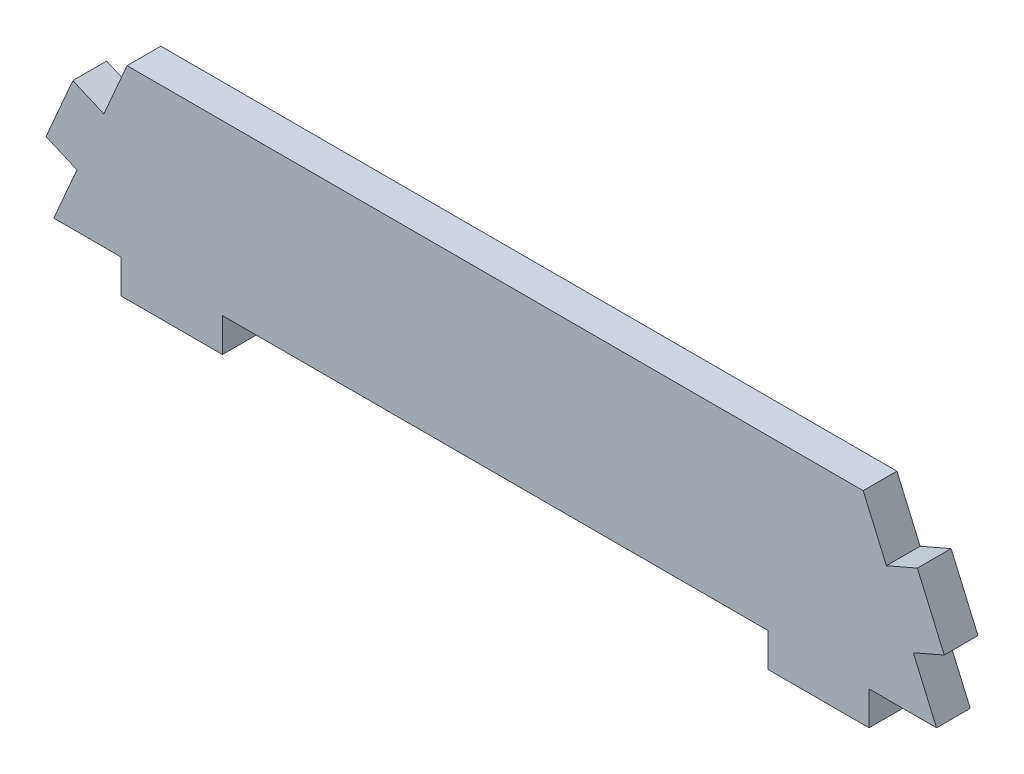
ISO-10303-21;
HEADER;
FILE_DESCRIPTION(('STEP AP214'),'2;1');
FILE_NAME('part.step','',(''),(''),'','','');
FILE_SCHEMA(('AUTOMOTIVE_DESIGN { 1 0 10303 214 1 1 1 1 }'));
ENDSEC;
DATA;
#1=APPLICATION_CONTEXT('core data for automotive mechanical design processes');
#2=APPLICATION_PROTOCOL_DEFINITION('international standard','automotive_design',2000,#1);
#3=PRODUCT_CONTEXT('',#1,'mechanical');
#4=PRODUCT('Part','Part','',(#3));
#5=PRODUCT_RELATED_PRODUCT_CATEGORY('part','',(#4));
#6=PRODUCT_DEFINITION_FORMATION('','',#4);
#7=PRODUCT_DEFINITION_CONTEXT('part definition',#1,'design');
#8=PRODUCT_DEFINITION('design','',#6,#7);
#9=PRODUCT_DEFINITION_SHAPE('','',#8);
#10=(LENGTH_UNIT() NAMED_UNIT(*) SI_UNIT(.MILLI.,.METRE.));
#11=(NAMED_UNIT(*) PLANE_ANGLE_UNIT() SI_UNIT($,.RADIAN.));
#12=(NAMED_UNIT(*) SI_UNIT($,.STERADIAN.) SOLID_ANGLE_UNIT());
#13=UNCERTAINTY_MEASURE_WITH_UNIT(LENGTH_MEASURE(1.E-05),#10,'distance_accuracy_value','');
#14=(GEOMETRIC_REPRESENTATION_CONTEXT(3) GLOBAL_UNCERTAINTY_ASSIGNED_CONTEXT((#13)) GLOBAL_UNIT_ASSIGNED_CONTEXT((#10,
#11,#12)) REPRESENTATION_CONTEXT('',''));
#15=CARTESIAN_POINT('',(0.,0.,0.));
#16=DIRECTION('',(0.,0.,1.));
#17=DIRECTION('',(1.,0.,0.));
#18=AXIS2_PLACEMENT_3D('',#15,#16,#17);
#19=CARTESIAN_POINT('',(0.,0.,5.));
#20=DIRECTION('',(0.,1.,0.));
#21=DIRECTION('',(0.,0.,1.));
#22=AXIS2_PLACEMENT_3D('',#19,#20,#21);
#23=PLANE('',#22);
#24=DIRECTION('',(1.,0.,0.));
#25=VECTOR('',#24,1.);
#26=CARTESIAN_POINT('',(0.,0.,0.));
#27=LINE('',#26,#25);
#28=CARTESIAN_POINT('',(-40.395,0.,0.));
#29=VERTEX_POINT('',#28);
#30=CARTESIAN_POINT('',(40.395,0.,0.));
#31=VERTEX_POINT('',#30);
#32=EDGE_CURVE('E148',#29,#31,#27,.T.);
#33=ORIENTED_EDGE('',*,*,#32,.T.);
#34=DIRECTION('',(0.,0.,-1.));
#35=VECTOR('',#34,1.);
#36=CARTESIAN_POINT('',(40.395,0.,5.));
#37=LINE('',#36,#35);
#38=CARTESIAN_POINT('',(40.395,0.,5.));
#39=VERTEX_POINT('',#38);
#40=EDGE_CURVE('E11',#39,#31,#37,.T.);
#41=ORIENTED_EDGE('',*,*,#40,.F.);
#42=DIRECTION('',(1.,0.,0.));
#43=VECTOR('',#42,1.);
#44=CARTESIAN_POINT('',(0.,0.,5.));
#45=LINE('',#44,#43);
#46=CARTESIAN_POINT('',(-40.395,0.,5.));
#47=VERTEX_POINT('',#46);
#48=EDGE_CURVE('E99',#47,#39,#45,.T.);
#49=ORIENTED_EDGE('',*,*,#48,.F.);
#50=DIRECTION('',(0.,0.,-1.));
#51=VECTOR('',#50,1.);
#52=CARTESIAN_POINT('',(-40.395,0.,5.));
#53=LINE('',#52,#51);
#54=EDGE_CURVE('E246',#47,#29,#53,.T.);
#55=ORIENTED_EDGE('',*,*,#54,.T.);
#56=EDGE_LOOP('',(#33,#41,#49,#55));
#57=FACE_BOUND('',#56,.T.);
#58=ADVANCED_FACE('F33',(#57),#23,.F.);
#59=CARTESIAN_POINT('',(40.395,-5.,5.));
#60=DIRECTION('',(1.,0.,0.));
#61=DIRECTION('',(0.,0.,-1.));
#62=AXIS2_PLACEMENT_3D('',#59,#60,#61);
#63=PLANE('',#62);
#64=DIRECTION('',(0.,-1.,0.));
#65=VECTOR('',#64,1.);
#66=CARTESIAN_POINT('',(40.395,-5.,0.));
#67=LINE('',#66,#65);
#68=CARTESIAN_POINT('',(40.395,-5.,0.));
#69=VERTEX_POINT('',#68);
#70=EDGE_CURVE('E150',#31,#69,#67,.T.);
#71=ORIENTED_EDGE('',*,*,#70,.T.);
#72=DIRECTION('',(0.,0.,-1.));
#73=VECTOR('',#72,1.);
#74=CARTESIAN_POINT('',(40.395,-5.,5.));
#75=LINE('',#74,#73);
#76=CARTESIAN_POINT('',(40.395,-5.,5.));
#77=VERTEX_POINT('',#76);
#78=EDGE_CURVE('E41',#77,#69,#75,.T.);
#79=ORIENTED_EDGE('',*,*,#78,.F.);
#80=DIRECTION('',(0.,-1.,0.));
#81=VECTOR('',#80,1.);
#82=CARTESIAN_POINT('',(40.395,-5.,5.));
#83=LINE('',#82,#81);
#84=EDGE_CURVE('E217',#39,#77,#83,.T.);
#85=ORIENTED_EDGE('',*,*,#84,.F.);
#86=ORIENTED_EDGE('',*,*,#40,.T.);
#87=EDGE_LOOP('',(#71,#79,#85,#86));
#88=FACE_BOUND('',#87,.T.);
#89=ADVANCED_FACE('F360',(#88),#63,.F.);
#90=CARTESIAN_POINT('',(55.395,-5.,5.));
#91=DIRECTION('',(0.,1.,0.));
#92=DIRECTION('',(-1.,0.,0.));
#93=AXIS2_PLACEMENT_3D('',#90,#91,#92);
#94=PLANE('',#93);
#95=DIRECTION('',(1.,0.,0.));
#96=VECTOR('',#95,1.);
#97=CARTESIAN_POINT('',(55.395,-5.,0.));
#98=LINE('',#97,#96);
#99=CARTESIAN_POINT('',(55.395,-5.,0.));
#100=VERTEX_POINT('',#99);
#101=EDGE_CURVE('E153',#69,#100,#98,.T.);
#102=ORIENTED_EDGE('',*,*,#101,.T.);
#103=DIRECTION('',(0.,0.,-1.));
#104=VECTOR('',#103,1.);
#105=CARTESIAN_POINT('',(55.395,-5.,5.));
#106=LINE('',#105,#104);
#107=CARTESIAN_POINT('',(55.395,-5.,5.));
#108=VERTEX_POINT('',#107);
#109=EDGE_CURVE('E181',#108,#100,#106,.T.);
#110=ORIENTED_EDGE('',*,*,#109,.F.);
#111=DIRECTION('',(1.,0.,0.));
#112=VECTOR('',#111,1.);
#113=CARTESIAN_POINT('',(55.395,-5.,5.));
#114=LINE('',#113,#112);
#115=EDGE_CURVE('E190',#77,#108,#114,.T.);
#116=ORIENTED_EDGE('',*,*,#115,.F.);
#117=ORIENTED_EDGE('',*,*,#78,.T.);
#118=EDGE_LOOP('',(#102,#110,#116,#117));
#119=FACE_BOUND('',#118,.T.);
#120=ADVANCED_FACE('F188',(#119),#94,.F.);
#121=CARTESIAN_POINT('',(55.395,0.,5.));
#122=DIRECTION('',(-1.,0.,0.));
#123=DIRECTION('',(0.,0.,1.));
#124=AXIS2_PLACEMENT_3D('',#121,#122,#123);
#125=PLANE('',#124);
#126=DIRECTION('',(0.,1.,0.));
#127=VECTOR('',#126,1.);
#128=CARTESIAN_POINT('',(55.395,0.,0.));
#129=LINE('',#128,#127);
#130=CARTESIAN_POINT('',(55.395,0.,0.));
#131=VERTEX_POINT('',#130);
#132=EDGE_CURVE('E155',#100,#131,#129,.T.);
#133=ORIENTED_EDGE('',*,*,#132,.T.);
#134=DIRECTION('',(0.,0.,-1.));
#135=VECTOR('',#134,1.);
#136=CARTESIAN_POINT('',(55.395,0.,5.));
#137=LINE('',#136,#135);
#138=CARTESIAN_POINT('',(55.395,0.,5.));
#139=VERTEX_POINT('',#138);
#140=EDGE_CURVE('E178',#139,#131,#137,.T.);
#141=ORIENTED_EDGE('',*,*,#140,.F.);
#142=DIRECTION('',(0.,1.,0.));
#143=VECTOR('',#142,1.);
#144=CARTESIAN_POINT('',(55.395,0.,5.));
#145=LINE('',#144,#143);
#146=EDGE_CURVE('E211',#108,#139,#145,.T.);
#147=ORIENTED_EDGE('',*,*,#146,.F.);
#148=ORIENTED_EDGE('',*,*,#109,.T.);
#149=EDGE_LOOP('',(#133,#141,#147,#148));
#150=FACE_BOUND('',#149,.T.);
#151=ADVANCED_FACE('F202',(#150),#125,.F.);
#152=CARTESIAN_POINT('',(55.395,0.,5.));
#153=DIRECTION('',(0.,1.,0.));
#154=DIRECTION('',(0.,0.,1.));
#155=AXIS2_PLACEMENT_3D('',#152,#153,#154);
#156=PLANE('',#155);
#157=DIRECTION('',(1.,0.,0.));
#158=VECTOR('',#157,1.);
#159=CARTESIAN_POINT('',(55.395,0.,0.));
#160=LINE('',#159,#158);
#161=CARTESIAN_POINT('',(65.395,0.,0.));
#162=VERTEX_POINT('',#161);
#163=EDGE_CURVE('E157',#131,#162,#160,.T.);
#164=ORIENTED_EDGE('',*,*,#163,.T.);
#165=DIRECTION('',(0.,0.,-1.));
#166=VECTOR('',#165,1.);
#167=CARTESIAN_POINT('',(65.395,0.,5.));
#168=LINE('',#167,#166);
#169=CARTESIAN_POINT('',(65.395,0.,5.));
#170=VERTEX_POINT('',#169);
#171=EDGE_CURVE('E175',#170,#162,#168,.T.);
#172=ORIENTED_EDGE('',*,*,#171,.F.);
#173=DIRECTION('',(1.,0.,0.));
#174=VECTOR('',#173,1.);
#175=CARTESIAN_POINT('',(55.395,0.,5.));
#176=LINE('',#175,#174);
#177=EDGE_CURVE('E208',#139,#170,#176,.T.);
#178=ORIENTED_EDGE('',*,*,#177,.F.);
#179=ORIENTED_EDGE('',*,*,#140,.T.);
#180=EDGE_LOOP('',(#164,#172,#178,#179));
#181=FACE_BOUND('',#180,.T.);
#182=ADVANCED_FACE('F206',(#181),#156,.F.);
#183=CARTESIAN_POINT('',(65.395,0.,5.));
#184=DIRECTION('',(-0.917105638976066,-0.398644261163136,0.));
#185=DIRECTION('',(0.398644261163136,-0.917105638976066,0.));
#186=AXIS2_PLACEMENT_3D('',#183,#184,#185);
#187=PLANE('',#186);
#188=DIRECTION('',(-0.398644261163136,0.917105638976066,0.));
#189=VECTOR('',#188,1.);
#190=CARTESIAN_POINT('',(65.395,0.,0.));
#191=LINE('',#190,#189);
#192=CARTESIAN_POINT('',(61.9547651664524,7.91447180511963,0.));
#193=VERTEX_POINT('',#192);
#194=EDGE_CURVE('E159',#162,#193,#191,.T.);
#195=ORIENTED_EDGE('',*,*,#194,.T.);
#196=DIRECTION('',(0.,0.,-1.));
#197=VECTOR('',#196,1.);
#198=CARTESIAN_POINT('',(61.9547651664524,7.91447180511963,5.));
#199=LINE('',#198,#197);
#200=CARTESIAN_POINT('',(61.9547651664524,7.91447180511963,5.));
#201=VERTEX_POINT('',#200);
#202=EDGE_CURVE('E172',#201,#193,#199,.T.);
#203=ORIENTED_EDGE('',*,*,#202,.F.);
#204=DIRECTION('',(-0.398644261163136,0.917105638976066,0.));
#205=VECTOR('',#204,1.);
#206=CARTESIAN_POINT('',(65.395,0.,5.));
#207=LINE('',#206,#205);
#208=EDGE_CURVE('E210',#170,#201,#207,.T.);
#209=ORIENTED_EDGE('',*,*,#208,.F.);
#210=ORIENTED_EDGE('',*,*,#171,.T.);
#211=EDGE_LOOP('',(#195,#203,#209,#210));
#212=FACE_BOUND('',#211,.T.);
#213=ADVANCED_FACE('F373',(#212),#187,.F.);
#214=CARTESIAN_POINT('',(66.5402933613328,9.9076931109353,5.));
#215=DIRECTION('',(-0.398644261163133,0.917105638976067,0.));
#216=DIRECTION('',(-0.917105638976067,-0.398644261163133,0.));
#217=AXIS2_PLACEMENT_3D('',#214,#215,#216);
#218=PLANE('',#217);
#219=DIRECTION('',(0.917105638976067,0.398644261163133,0.));
#220=VECTOR('',#219,1.);
#221=CARTESIAN_POINT('',(66.5402933613328,9.9076931109353,0.));
#222=LINE('',#221,#220);
#223=CARTESIAN_POINT('',(66.5402933613328,9.9076931109353,0.));
#224=VERTEX_POINT('',#223);
#225=EDGE_CURVE('E161',#193,#224,#222,.T.);
#226=ORIENTED_EDGE('',*,*,#225,.T.);
#227=DIRECTION('',(0.,0.,-1.));
#228=VECTOR('',#227,1.);
#229=CARTESIAN_POINT('',(66.5402933613328,9.9076931109353,5.));
#230=LINE('',#229,#228);
#231=CARTESIAN_POINT('',(66.5402933613328,9.9076931109353,5.));
#232=VERTEX_POINT('',#231);
#233=EDGE_CURVE('E137',#232,#224,#230,.T.);
#234=ORIENTED_EDGE('',*,*,#233,.F.);
#235=DIRECTION('',(0.917105638976067,0.398644261163133,0.));
#236=VECTOR('',#235,1.);
#237=CARTESIAN_POINT('',(66.5402933613328,9.9076931109353,5.));
#238=LINE('',#237,#236);
#239=EDGE_CURVE('E128',#201,#232,#238,.T.);
#240=ORIENTED_EDGE('',*,*,#239,.F.);
#241=ORIENTED_EDGE('',*,*,#202,.T.);
#242=EDGE_LOOP('',(#226,#234,#240,#241));
#243=FACE_BOUND('',#242,.T.);
#244=ADVANCED_FACE('F376',(#243),#218,.F.);
#245=CARTESIAN_POINT('',(62.5538507497014,19.078749500696,5.));
#246=DIRECTION('',(-0.917105638976066,-0.398644261163135,0.));
#247=DIRECTION('',(0.398644261163135,-0.917105638976066,0.));
#248=AXIS2_PLACEMENT_3D('',#245,#246,#247);
#249=PLANE('',#248);
#250=DIRECTION('',(-0.398644261163135,0.917105638976066,0.));
#251=VECTOR('',#250,1.);
#252=CARTESIAN_POINT('',(62.5538507497014,19.078749500696,0.));
#253=LINE('',#252,#251);
#254=CARTESIAN_POINT('',(62.5538507497014,19.078749500696,0.));
#255=VERTEX_POINT('',#254);
#256=EDGE_CURVE('E136',#224,#255,#253,.T.);
#257=ORIENTED_EDGE('',*,*,#256,.T.);
#258=DIRECTION('',(0.,0.,-1.));
#259=VECTOR('',#258,1.);
#260=CARTESIAN_POINT('',(62.5538507497014,19.078749500696,5.));
#261=LINE('',#260,#259);
#262=CARTESIAN_POINT('',(62.5538507497014,19.078749500696,5.));
#263=VERTEX_POINT('',#262);
#264=EDGE_CURVE('E133',#263,#255,#261,.T.);
#265=ORIENTED_EDGE('',*,*,#264,.F.);
#266=DIRECTION('',(-0.398644261163135,0.917105638976066,0.));
#267=VECTOR('',#266,1.);
#268=CARTESIAN_POINT('',(62.5538507497014,19.078749500696,5.));
#269=LINE('',#268,#267);
#270=EDGE_CURVE('E122',#232,#263,#269,.T.);
#271=ORIENTED_EDGE('',*,*,#270,.F.);
#272=ORIENTED_EDGE('',*,*,#233,.T.);
#273=EDGE_LOOP('',(#257,#265,#271,#272));
#274=FACE_BOUND('',#273,.T.);
#275=ADVANCED_FACE('F134',(#274),#249,.F.);
#276=CARTESIAN_POINT('',(57.9683225548211,17.0855281948803,5.));
#277=DIRECTION('',(0.398644261163133,-0.917105638976067,0.));
#278=DIRECTION('',(0.917105638976067,0.398644261163133,0.));
#279=AXIS2_PLACEMENT_3D('',#276,#277,#278);
#280=PLANE('',#279);
#281=DIRECTION('',(-0.917105638976067,-0.398644261163133,0.));
#282=VECTOR('',#281,1.);
#283=CARTESIAN_POINT('',(57.9683225548211,17.0855281948803,0.));
#284=LINE('',#283,#282);
#285=CARTESIAN_POINT('',(57.9683225548211,17.0855281948803,0.));
#286=VERTEX_POINT('',#285);
#287=EDGE_CURVE('E85',#255,#286,#284,.T.);
#288=ORIENTED_EDGE('',*,*,#287,.T.);
#289=DIRECTION('',(0.,0.,-1.));
#290=VECTOR('',#289,1.);
#291=CARTESIAN_POINT('',(57.9683225548211,17.0855281948803,5.));
#292=LINE('',#291,#290);
#293=CARTESIAN_POINT('',(57.9683225548211,17.0855281948803,5.));
#294=VERTEX_POINT('',#293);
#295=EDGE_CURVE('E138',#294,#286,#292,.T.);
#296=ORIENTED_EDGE('',*,*,#295,.F.);
#297=DIRECTION('',(-0.917105638976067,-0.398644261163133,0.));
#298=VECTOR('',#297,1.);
#299=CARTESIAN_POINT('',(57.9683225548211,17.0855281948803,5.));
#300=LINE('',#299,#298);
#301=EDGE_CURVE('E126',#263,#294,#300,.T.);
#302=ORIENTED_EDGE('',*,*,#301,.F.);
#303=ORIENTED_EDGE('',*,*,#264,.T.);
#304=EDGE_LOOP('',(#288,#296,#302,#303));
#305=FACE_BOUND('',#304,.T.);
#306=ADVANCED_FACE('F140',(#305),#280,.F.);
#307=CARTESIAN_POINT('',(57.9683225548211,17.0855281948803,5.));
#308=DIRECTION('',(-0.917105638976066,-0.398644261163135,0.));
#309=DIRECTION('',(0.398644261163135,-0.917105638976066,0.));
#310=AXIS2_PLACEMENT_3D('',#307,#308,#309);
#311=PLANE('',#310);
#312=DIRECTION('',(-0.398644261163135,0.917105638976066,0.));
#313=VECTOR('',#312,1.);
#314=CARTESIAN_POINT('',(57.9683225548211,17.0855281948803,0.));
#315=LINE('',#314,#313);
#316=CARTESIAN_POINT('',(54.5280877212735,25.,0.));
#317=VERTEX_POINT('',#316);
#318=EDGE_CURVE('E91',#286,#317,#315,.T.);
#319=ORIENTED_EDGE('',*,*,#318,.T.);
#320=DIRECTION('',(0.,0.,-1.));
#321=VECTOR('',#320,1.);
#322=CARTESIAN_POINT('',(54.5280877212735,25.,5.));
#323=LINE('',#322,#321);
#324=CARTESIAN_POINT('',(54.5280877212735,25.,5.));
#325=VERTEX_POINT('',#324);
#326=EDGE_CURVE('E147',#325,#317,#323,.T.);
#327=ORIENTED_EDGE('',*,*,#326,.F.);
#328=DIRECTION('',(-0.398644261163135,0.917105638976066,0.));
#329=VECTOR('',#328,1.);
#330=CARTESIAN_POINT('',(57.9683225548211,17.0855281948803,5.));
#331=LINE('',#330,#329);
#332=EDGE_CURVE('E49',#294,#325,#331,.T.);
#333=ORIENTED_EDGE('',*,*,#332,.F.);
#334=ORIENTED_EDGE('',*,*,#295,.T.);
#335=EDGE_LOOP('',(#319,#327,#333,#334));
#336=FACE_BOUND('',#335,.T.);
#337=ADVANCED_FACE('F385',(#336),#311,.F.);
#338=CARTESIAN_POINT('',(0.,25.,5.));
#339=DIRECTION('',(0.,-1.,0.));
#340=DIRECTION('',(0.,0.,-1.));
#341=AXIS2_PLACEMENT_3D('',#338,#339,#340);
#342=PLANE('',#341);
#343=DIRECTION('',(-1.,0.,0.));
#344=VECTOR('',#343,1.);
#345=CARTESIAN_POINT('',(0.,25.,0.));
#346=LINE('',#345,#344);
#347=CARTESIAN_POINT('',(-54.5280877212735,25.,0.));
#348=VERTEX_POINT('',#347);
#349=EDGE_CURVE('E166',#317,#348,#346,.T.);
#350=ORIENTED_EDGE('',*,*,#349,.T.);
#351=DIRECTION('',(0.,0.,-1.));
#352=VECTOR('',#351,1.);
#353=CARTESIAN_POINT('',(-54.5280877212735,25.,5.));
#354=LINE('',#353,#352);
#355=CARTESIAN_POINT('',(-54.5280877212735,25.,5.));
#356=VERTEX_POINT('',#355);
#357=EDGE_CURVE('E151',#356,#348,#354,.T.);
#358=ORIENTED_EDGE('',*,*,#357,.F.);
#359=DIRECTION('',(-1.,0.,0.));
#360=VECTOR('',#359,1.);
#361=CARTESIAN_POINT('',(0.,25.,5.));
#362=LINE('',#361,#360);
#363=EDGE_CURVE('E142',#325,#356,#362,.T.);
#364=ORIENTED_EDGE('',*,*,#363,.F.);
#365=ORIENTED_EDGE('',*,*,#326,.T.);
#366=EDGE_LOOP('',(#350,#358,#364,#365));
#367=FACE_BOUND('',#366,.T.);
#368=ADVANCED_FACE('F388',(#367),#342,.F.);
#369=CARTESIAN_POINT('',(0.,0.,5.));
#370=DIRECTION('',(0.,0.,-1.));
#371=DIRECTION('',(-1.,0.,0.));
#372=AXIS2_PLACEMENT_3D('',#369,#370,#371);
#373=PLANE('',#372);
#374=ORIENTED_EDGE('',*,*,#363,.T.);
#375=DIRECTION('',(0.398644261163135,0.917105638976066,0.));
#376=VECTOR('',#375,1.);
#377=CARTESIAN_POINT('',(-57.9683225548211,17.0855281948803,5.));
#378=LINE('',#377,#376);
#379=CARTESIAN_POINT('',(-57.9683225548211,17.0855281948803,5.));
#380=VERTEX_POINT('',#379);
#381=EDGE_CURVE('E253',#380,#356,#378,.T.);
#382=ORIENTED_EDGE('',*,*,#381,.F.);
#383=DIRECTION('',(0.917105638976067,-0.398644261163133,0.));
#384=VECTOR('',#383,1.);
#385=CARTESIAN_POINT('',(-57.9683225548211,17.0855281948803,5.));
#386=LINE('',#385,#384);
#387=CARTESIAN_POINT('',(-62.5538507497014,19.078749500696,5.));
#388=VERTEX_POINT('',#387);
#389=EDGE_CURVE('E298',#388,#380,#386,.T.);
#390=ORIENTED_EDGE('',*,*,#389,.F.);
#391=DIRECTION('',(0.398644261163135,0.917105638976066,0.));
#392=VECTOR('',#391,1.);
#393=CARTESIAN_POINT('',(-62.5538507497014,19.078749500696,5.));
#394=LINE('',#393,#392);
#395=CARTESIAN_POINT('',(-66.5402933613328,9.9076931109353,5.));
#396=VERTEX_POINT('',#395);
#397=EDGE_CURVE('E295',#396,#388,#394,.T.);
#398=ORIENTED_EDGE('',*,*,#397,.F.);
#399=DIRECTION('',(-0.917105638976067,0.398644261163133,0.));
#400=VECTOR('',#399,1.);
#401=CARTESIAN_POINT('',(-66.5402933613328,9.9076931109353,5.));
#402=LINE('',#401,#400);
#403=CARTESIAN_POINT('',(-61.9547651664524,7.91447180511963,5.));
#404=VERTEX_POINT('',#403);
#405=EDGE_CURVE('E292',#404,#396,#402,.T.);
#406=ORIENTED_EDGE('',*,*,#405,.F.);
#407=DIRECTION('',(0.398644261163136,0.917105638976066,0.));
#408=VECTOR('',#407,1.);
#409=CARTESIAN_POINT('',(-65.395,0.,5.));
#410=LINE('',#409,#408);
#411=CARTESIAN_POINT('',(-65.395,0.,5.));
#412=VERTEX_POINT('',#411);
#413=EDGE_CURVE('E289',#412,#404,#410,.T.);
#414=ORIENTED_EDGE('',*,*,#413,.F.);
#415=DIRECTION('',(-1.,0.,0.));
#416=VECTOR('',#415,1.);
#417=CARTESIAN_POINT('',(-55.395,0.,5.));
#418=LINE('',#417,#416);
#419=CARTESIAN_POINT('',(-55.395,0.,5.));
#420=VERTEX_POINT('',#419);
#421=EDGE_CURVE('E286',#420,#412,#418,.T.);
#422=ORIENTED_EDGE('',*,*,#421,.F.);
#423=DIRECTION('',(0.,1.,0.));
#424=VECTOR('',#423,1.);
#425=CARTESIAN_POINT('',(-55.395,0.,5.));
#426=LINE('',#425,#424);
#427=CARTESIAN_POINT('',(-55.395,-5.,5.));
#428=VERTEX_POINT('',#427);
#429=EDGE_CURVE('E283',#428,#420,#426,.T.);
#430=ORIENTED_EDGE('',*,*,#429,.F.);
#431=DIRECTION('',(-1.,0.,0.));
#432=VECTOR('',#431,1.);
#433=CARTESIAN_POINT('',(-55.395,-5.,5.));
#434=LINE('',#433,#432);
#435=CARTESIAN_POINT('',(-40.395,-5.,5.));
#436=VERTEX_POINT('',#435);
#437=EDGE_CURVE('E280',#436,#428,#434,.T.);
#438=ORIENTED_EDGE('',*,*,#437,.F.);
#439=DIRECTION('',(0.,-1.,0.));
#440=VECTOR('',#439,1.);
#441=CARTESIAN_POINT('',(-40.395,-5.,5.));
#442=LINE('',#441,#440);
#443=EDGE_CURVE('E249',#47,#436,#442,.T.);
#444=ORIENTED_EDGE('',*,*,#443,.F.);
#445=ORIENTED_EDGE('',*,*,#48,.T.);
#446=ORIENTED_EDGE('',*,*,#84,.T.);
#447=ORIENTED_EDGE('',*,*,#115,.T.);
#448=ORIENTED_EDGE('',*,*,#146,.T.);
#449=ORIENTED_EDGE('',*,*,#177,.T.);
#450=ORIENTED_EDGE('',*,*,#208,.T.);
#451=ORIENTED_EDGE('',*,*,#239,.T.);
#452=ORIENTED_EDGE('',*,*,#270,.T.);
#453=ORIENTED_EDGE('',*,*,#301,.T.);
#454=ORIENTED_EDGE('',*,*,#332,.T.);
#455=EDGE_LOOP('',(#374,#382,#390,#398,#406,#414,#422,#430,#438,#444,#445,#446,#447,#448,#449,
#450,#451,#452,#453,#454));
#456=FACE_BOUND('',#455,.T.);
#457=ADVANCED_FACE('F124',(#456),#373,.F.);
#458=CARTESIAN_POINT('',(0.,0.,0.));
#459=DIRECTION('',(0.,0.,-1.));
#460=DIRECTION('',(-1.,0.,0.));
#461=AXIS2_PLACEMENT_3D('',#458,#459,#460);
#462=PLANE('',#461);
#463=ORIENTED_EDGE('',*,*,#32,.F.);
#464=DIRECTION('',(0.,-1.,0.));
#465=VECTOR('',#464,1.);
#466=CARTESIAN_POINT('',(-40.395,-5.,0.));
#467=LINE('',#466,#465);
#468=CARTESIAN_POINT('',(-40.395,-5.,0.));
#469=VERTEX_POINT('',#468);
#470=EDGE_CURVE('E250',#29,#469,#467,.T.);
#471=ORIENTED_EDGE('',*,*,#470,.T.);
#472=DIRECTION('',(-1.,0.,0.));
#473=VECTOR('',#472,1.);
#474=CARTESIAN_POINT('',(-55.395,-5.,0.));
#475=LINE('',#474,#473);
#476=CARTESIAN_POINT('',(-55.395,-5.,0.));
#477=VERTEX_POINT('',#476);
#478=EDGE_CURVE('E254',#469,#477,#475,.T.);
#479=ORIENTED_EDGE('',*,*,#478,.T.);
#480=DIRECTION('',(0.,1.,0.));
#481=VECTOR('',#480,1.);
#482=CARTESIAN_POINT('',(-55.395,0.,0.));
#483=LINE('',#482,#481);
#484=CARTESIAN_POINT('',(-55.395,0.,0.));
#485=VERTEX_POINT('',#484);
#486=EDGE_CURVE('E257',#477,#485,#483,.T.);
#487=ORIENTED_EDGE('',*,*,#486,.T.);
#488=DIRECTION('',(-1.,0.,0.));
#489=VECTOR('',#488,1.);
#490=CARTESIAN_POINT('',(-55.395,0.,0.));
#491=LINE('',#490,#489);
#492=CARTESIAN_POINT('',(-65.395,0.,0.));
#493=VERTEX_POINT('',#492);
#494=EDGE_CURVE('E260',#485,#493,#491,.T.);
#495=ORIENTED_EDGE('',*,*,#494,.T.);
#496=DIRECTION('',(0.398644261163136,0.917105638976066,0.));
#497=VECTOR('',#496,1.);
#498=CARTESIAN_POINT('',(-65.395,0.,0.));
#499=LINE('',#498,#497);
#500=CARTESIAN_POINT('',(-61.9547651664524,7.91447180511963,0.));
#501=VERTEX_POINT('',#500);
#502=EDGE_CURVE('E263',#493,#501,#499,.T.);
#503=ORIENTED_EDGE('',*,*,#502,.T.);
#504=DIRECTION('',(-0.917105638976067,0.398644261163133,0.));
#505=VECTOR('',#504,1.);
#506=CARTESIAN_POINT('',(-66.5402933613328,9.9076931109353,0.));
#507=LINE('',#506,#505);
#508=CARTESIAN_POINT('',(-66.5402933613328,9.9076931109353,0.));
#509=VERTEX_POINT('',#508);
#510=EDGE_CURVE('E266',#501,#509,#507,.T.);
#511=ORIENTED_EDGE('',*,*,#510,.T.);
#512=DIRECTION('',(0.398644261163135,0.917105638976066,0.));
#513=VECTOR('',#512,1.);
#514=CARTESIAN_POINT('',(-62.5538507497014,19.078749500696,0.));
#515=LINE('',#514,#513);
#516=CARTESIAN_POINT('',(-62.5538507497014,19.078749500696,0.));
#517=VERTEX_POINT('',#516);
#518=EDGE_CURVE('E269',#509,#517,#515,.T.);
#519=ORIENTED_EDGE('',*,*,#518,.T.);
#520=DIRECTION('',(0.917105638976067,-0.398644261163133,0.));
#521=VECTOR('',#520,1.);
#522=CARTESIAN_POINT('',(-57.9683225548211,17.0855281948803,0.));
#523=LINE('',#522,#521);
#524=CARTESIAN_POINT('',(-57.9683225548211,17.0855281948803,0.));
#525=VERTEX_POINT('',#524);
#526=EDGE_CURVE('E272',#517,#525,#523,.T.);
#527=ORIENTED_EDGE('',*,*,#526,.T.);
#528=DIRECTION('',(0.398644261163135,0.917105638976066,0.));
#529=VECTOR('',#528,1.);
#530=CARTESIAN_POINT('',(-57.9683225548211,17.0855281948803,0.));
#531=LINE('',#530,#529);
#532=EDGE_CURVE('E275',#525,#348,#531,.T.);
#533=ORIENTED_EDGE('',*,*,#532,.T.);
#534=ORIENTED_EDGE('',*,*,#349,.F.);
#535=ORIENTED_EDGE('',*,*,#318,.F.);
#536=ORIENTED_EDGE('',*,*,#287,.F.);
#537=ORIENTED_EDGE('',*,*,#256,.F.);
#538=ORIENTED_EDGE('',*,*,#225,.F.);
#539=ORIENTED_EDGE('',*,*,#194,.F.);
#540=ORIENTED_EDGE('',*,*,#163,.F.);
#541=ORIENTED_EDGE('',*,*,#132,.F.);
#542=ORIENTED_EDGE('',*,*,#101,.F.);
#543=ORIENTED_EDGE('',*,*,#70,.F.);
#544=EDGE_LOOP('',(#463,#471,#479,#487,#495,#503,#511,#519,#527,#533,#534,#535,#536,#537,#538,
#539,#540,#541,#542,#543));
#545=FACE_BOUND('',#544,.T.);
#546=ADVANCED_FACE('F197',(#545),#462,.T.);
#547=CARTESIAN_POINT('',(-57.9683225548211,17.0855281948803,5.));
#548=DIRECTION('',(-0.917105638976066,0.398644261163135,0.));
#549=DIRECTION('',(-0.398644261163135,-0.917105638976066,0.));
#550=AXIS2_PLACEMENT_3D('',#547,#548,#549);
#551=PLANE('',#550);
#552=ORIENTED_EDGE('',*,*,#532,.F.);
#553=DIRECTION('',(0.,0.,-1.));
#554=VECTOR('',#553,1.);
#555=CARTESIAN_POINT('',(-57.9683225548211,17.0855281948803,5.));
#556=LINE('',#555,#554);
#557=EDGE_CURVE('E222',#380,#525,#556,.T.);
#558=ORIENTED_EDGE('',*,*,#557,.F.);
#559=ORIENTED_EDGE('',*,*,#381,.T.);
#560=ORIENTED_EDGE('',*,*,#357,.T.);
#561=EDGE_LOOP('',(#552,#558,#559,#560));
#562=FACE_BOUND('',#561,.T.);
#563=ADVANCED_FACE('F307',(#562),#551,.T.);
#564=CARTESIAN_POINT('',(-57.9683225548211,17.0855281948803,5.));
#565=DIRECTION('',(0.398644261163133,0.917105638976067,0.));
#566=DIRECTION('',(-0.917105638976067,0.398644261163133,0.));
#567=AXIS2_PLACEMENT_3D('',#564,#565,#566);
#568=PLANE('',#567);
#569=ORIENTED_EDGE('',*,*,#526,.F.);
#570=DIRECTION('',(0.,0.,-1.));
#571=VECTOR('',#570,1.);
#572=CARTESIAN_POINT('',(-62.5538507497014,19.078749500696,5.));
#573=LINE('',#572,#571);
#574=EDGE_CURVE('E225',#388,#517,#573,.T.);
#575=ORIENTED_EDGE('',*,*,#574,.F.);
#576=ORIENTED_EDGE('',*,*,#389,.T.);
#577=ORIENTED_EDGE('',*,*,#557,.T.);
#578=EDGE_LOOP('',(#569,#575,#576,#577));
#579=FACE_BOUND('',#578,.T.);
#580=ADVANCED_FACE('F320',(#579),#568,.T.);
#581=CARTESIAN_POINT('',(-62.5538507497014,19.078749500696,5.));
#582=DIRECTION('',(-0.917105638976066,0.398644261163135,0.));
#583=DIRECTION('',(-0.398644261163135,-0.917105638976066,0.));
#584=AXIS2_PLACEMENT_3D('',#581,#582,#583);
#585=PLANE('',#584);
#586=ORIENTED_EDGE('',*,*,#518,.F.);
#587=DIRECTION('',(0.,0.,-1.));
#588=VECTOR('',#587,1.);
#589=CARTESIAN_POINT('',(-66.5402933613328,9.9076931109353,5.));
#590=LINE('',#589,#588);
#591=EDGE_CURVE('E228',#396,#509,#590,.T.);
#592=ORIENTED_EDGE('',*,*,#591,.F.);
#593=ORIENTED_EDGE('',*,*,#397,.T.);
#594=ORIENTED_EDGE('',*,*,#574,.T.);
#595=EDGE_LOOP('',(#586,#592,#593,#594));
#596=FACE_BOUND('',#595,.T.);
#597=ADVANCED_FACE('F327',(#596),#585,.T.);
#598=CARTESIAN_POINT('',(-66.5402933613328,9.9076931109353,5.));
#599=DIRECTION('',(-0.398644261163133,-0.917105638976067,0.));
#600=DIRECTION('',(0.917105638976067,-0.398644261163133,0.));
#601=AXIS2_PLACEMENT_3D('',#598,#599,#600);
#602=PLANE('',#601);
#603=ORIENTED_EDGE('',*,*,#510,.F.);
#604=DIRECTION('',(0.,0.,-1.));
#605=VECTOR('',#604,1.);
#606=CARTESIAN_POINT('',(-61.9547651664524,7.91447180511963,5.));
#607=LINE('',#606,#605);
#608=EDGE_CURVE('E231',#404,#501,#607,.T.);
#609=ORIENTED_EDGE('',*,*,#608,.F.);
#610=ORIENTED_EDGE('',*,*,#405,.T.);
#611=ORIENTED_EDGE('',*,*,#591,.T.);
#612=EDGE_LOOP('',(#603,#609,#610,#611));
#613=FACE_BOUND('',#612,.T.);
#614=ADVANCED_FACE('F402',(#613),#602,.T.);
#615=CARTESIAN_POINT('',(-65.395,0.,5.));
#616=DIRECTION('',(-0.917105638976066,0.398644261163136,0.));
#617=DIRECTION('',(-0.398644261163136,-0.917105638976066,0.));
#618=AXIS2_PLACEMENT_3D('',#615,#616,#617);
#619=PLANE('',#618);
#620=ORIENTED_EDGE('',*,*,#502,.F.);
#621=DIRECTION('',(0.,0.,-1.));
#622=VECTOR('',#621,1.);
#623=CARTESIAN_POINT('',(-65.395,0.,5.));
#624=LINE('',#623,#622);
#625=EDGE_CURVE('E234',#412,#493,#624,.T.);
#626=ORIENTED_EDGE('',*,*,#625,.F.);
#627=ORIENTED_EDGE('',*,*,#413,.T.);
#628=ORIENTED_EDGE('',*,*,#608,.T.);
#629=EDGE_LOOP('',(#620,#626,#627,#628));
#630=FACE_BOUND('',#629,.T.);
#631=ADVANCED_FACE('F405',(#630),#619,.T.);
#632=CARTESIAN_POINT('',(-55.395,0.,5.));
#633=DIRECTION('',(0.,-1.,0.));
#634=DIRECTION('',(0.,0.,-1.));
#635=AXIS2_PLACEMENT_3D('',#632,#633,#634);
#636=PLANE('',#635);
#637=ORIENTED_EDGE('',*,*,#494,.F.);
#638=DIRECTION('',(0.,0.,-1.));
#639=VECTOR('',#638,1.);
#640=CARTESIAN_POINT('',(-55.395,0.,5.));
#641=LINE('',#640,#639);
#642=EDGE_CURVE('E237',#420,#485,#641,.T.);
#643=ORIENTED_EDGE('',*,*,#642,.F.);
#644=ORIENTED_EDGE('',*,*,#421,.T.);
#645=ORIENTED_EDGE('',*,*,#625,.T.);
#646=EDGE_LOOP('',(#637,#643,#644,#645));
#647=FACE_BOUND('',#646,.T.);
#648=ADVANCED_FACE('F409',(#647),#636,.T.);
#649=CARTESIAN_POINT('',(-55.395,0.,5.));
#650=DIRECTION('',(-1.,0.,0.));
#651=DIRECTION('',(0.,0.,1.));
#652=AXIS2_PLACEMENT_3D('',#649,#650,#651);
#653=PLANE('',#652);
#654=ORIENTED_EDGE('',*,*,#486,.F.);
#655=DIRECTION('',(0.,0.,-1.));
#656=VECTOR('',#655,1.);
#657=CARTESIAN_POINT('',(-55.395,-5.,5.));
#658=LINE('',#657,#656);
#659=EDGE_CURVE('E240',#428,#477,#658,.T.);
#660=ORIENTED_EDGE('',*,*,#659,.F.);
#661=ORIENTED_EDGE('',*,*,#429,.T.);
#662=ORIENTED_EDGE('',*,*,#642,.T.);
#663=EDGE_LOOP('',(#654,#660,#661,#662));
#664=FACE_BOUND('',#663,.T.);
#665=ADVANCED_FACE('F356',(#664),#653,.T.);
#666=CARTESIAN_POINT('',(-55.395,-5.,5.));
#667=DIRECTION('',(0.,-1.,0.));
#668=DIRECTION('',(1.,0.,0.));
#669=AXIS2_PLACEMENT_3D('',#666,#667,#668);
#670=PLANE('',#669);
#671=ORIENTED_EDGE('',*,*,#478,.F.);
#672=DIRECTION('',(0.,0.,-1.));
#673=VECTOR('',#672,1.);
#674=CARTESIAN_POINT('',(-40.395,-5.,5.));
#675=LINE('',#674,#673);
#676=EDGE_CURVE('E243',#436,#469,#675,.T.);
#677=ORIENTED_EDGE('',*,*,#676,.F.);
#678=ORIENTED_EDGE('',*,*,#437,.T.);
#679=ORIENTED_EDGE('',*,*,#659,.T.);
#680=EDGE_LOOP('',(#671,#677,#678,#679));
#681=FACE_BOUND('',#680,.T.);
#682=ADVANCED_FACE('F351',(#681),#670,.T.);
#683=CARTESIAN_POINT('',(-40.395,-5.,5.));
#684=DIRECTION('',(1.,0.,0.));
#685=DIRECTION('',(0.,0.,-1.));
#686=AXIS2_PLACEMENT_3D('',#683,#684,#685);
#687=PLANE('',#686);
#688=ORIENTED_EDGE('',*,*,#470,.F.);
#689=ORIENTED_EDGE('',*,*,#54,.F.);
#690=ORIENTED_EDGE('',*,*,#443,.T.);
#691=ORIENTED_EDGE('',*,*,#676,.T.);
#692=EDGE_LOOP('',(#688,#689,#690,#691));
#693=FACE_BOUND('',#692,.T.);
#694=ADVANCED_FACE('F349',(#693),#687,.T.);
#695=CLOSED_SHELL('',(#58,#89,#120,#151,#182,#213,#244,#275,#306,#337,#368,#457,#546,#563,#580,
#597,#614,#631,#648,#665,#682,#694));
#696=MANIFOLD_SOLID_BREP('B2',#695);
#697=ADVANCED_BREP_SHAPE_REPRESENTATION('',(#18,#696),#14);
#698=SHAPE_DEFINITION_REPRESENTATION(#9,#697);
ENDSEC;
END-ISO-10303-21;
